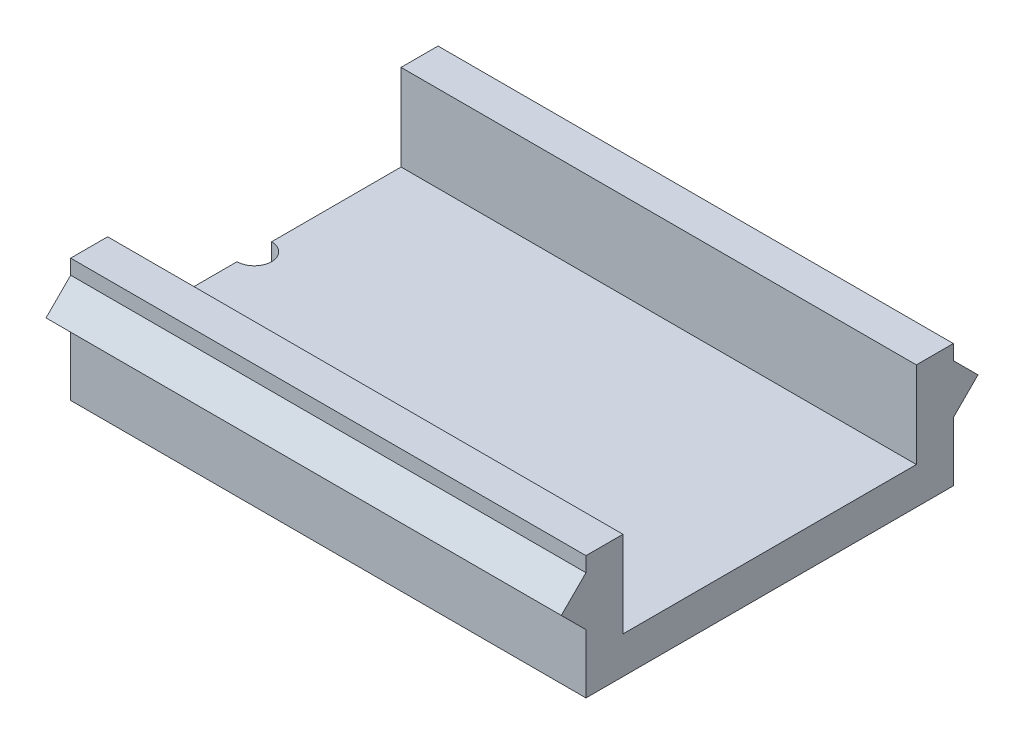
ISO-10303-21;
HEADER;
FILE_DESCRIPTION(('STEP AP214'),'2;1');
FILE_NAME('part.step','',(''),(''),'','','');
FILE_SCHEMA(('AUTOMOTIVE_DESIGN { 1 0 10303 214 1 1 1 1 }'));
ENDSEC;
DATA;
#1=APPLICATION_CONTEXT('core data for automotive mechanical design processes');
#2=APPLICATION_PROTOCOL_DEFINITION('international standard','automotive_design',2000,#1);
#3=PRODUCT_CONTEXT('',#1,'mechanical');
#4=PRODUCT('Part','Part','',(#3));
#5=PRODUCT_RELATED_PRODUCT_CATEGORY('part','',(#4));
#6=PRODUCT_DEFINITION_FORMATION('','',#4);
#7=PRODUCT_DEFINITION_CONTEXT('part definition',#1,'design');
#8=PRODUCT_DEFINITION('design','',#6,#7);
#9=PRODUCT_DEFINITION_SHAPE('','',#8);
#10=(LENGTH_UNIT() NAMED_UNIT(*) SI_UNIT(.MILLI.,.METRE.));
#11=(NAMED_UNIT(*) PLANE_ANGLE_UNIT() SI_UNIT($,.RADIAN.));
#12=(NAMED_UNIT(*) SI_UNIT($,.STERADIAN.) SOLID_ANGLE_UNIT());
#13=UNCERTAINTY_MEASURE_WITH_UNIT(LENGTH_MEASURE(1.E-05),#10,'distance_accuracy_value','');
#14=(GEOMETRIC_REPRESENTATION_CONTEXT(3) GLOBAL_UNCERTAINTY_ASSIGNED_CONTEXT((#13)) GLOBAL_UNIT_ASSIGNED_CONTEXT((#10,
#11,#12)) REPRESENTATION_CONTEXT('',''));
#15=CARTESIAN_POINT('',(0.,0.,0.));
#16=DIRECTION('',(0.,0.,1.));
#17=DIRECTION('',(1.,0.,0.));
#18=AXIS2_PLACEMENT_3D('',#15,#16,#17);
#19=CARTESIAN_POINT('',(-20.9,3.,0.));
#20=DIRECTION('',(0.,1.,0.));
#21=DIRECTION('',(0.,0.,1.));
#22=AXIS2_PLACEMENT_3D('',#19,#20,#21);
#23=PLANE('',#22);
#24=DIRECTION('',(-1.,0.,0.));
#25=VECTOR('',#24,1.);
#26=CARTESIAN_POINT('',(29.5023252670426,3.,11.9));
#27=LINE('',#26,#25);
#28=CARTESIAN_POINT('',(20.9,3.,11.9));
#29=VERTEX_POINT('',#28);
#30=CARTESIAN_POINT('',(-20.9,3.,11.9));
#31=VERTEX_POINT('',#30);
#32=EDGE_CURVE('E190',#29,#31,#27,.T.);
#33=ORIENTED_EDGE('',*,*,#32,.F.);
#34=DIRECTION('',(0.,0.,-1.));
#35=VECTOR('',#34,1.);
#36=CARTESIAN_POINT('',(20.9,3.,14.9));
#37=LINE('',#36,#35);
#38=CARTESIAN_POINT('',(20.9,3.,-11.9));
#39=VERTEX_POINT('',#38);
#40=EDGE_CURVE('E240',#29,#39,#37,.T.);
#41=ORIENTED_EDGE('',*,*,#40,.T.);
#42=DIRECTION('',(-1.,0.,0.));
#43=VECTOR('',#42,1.);
#44=CARTESIAN_POINT('',(29.5023252670426,3.,-11.9));
#45=LINE('',#44,#43);
#46=CARTESIAN_POINT('',(-20.9,3.,-11.9));
#47=VERTEX_POINT('',#46);
#48=EDGE_CURVE('E225',#39,#47,#45,.T.);
#49=ORIENTED_EDGE('',*,*,#48,.T.);
#50=DIRECTION('',(0.,0.,-1.));
#51=VECTOR('',#50,1.);
#52=CARTESIAN_POINT('',(-20.9,3.,-1.4));
#53=LINE('',#52,#51);
#54=CARTESIAN_POINT('',(-20.9,3.,-1.4));
#55=VERTEX_POINT('',#54);
#56=EDGE_CURVE('E242',#55,#47,#53,.T.);
#57=ORIENTED_EDGE('',*,*,#56,.F.);
#58=CARTESIAN_POINT('',(-20.9,3.,0.));
#59=DIRECTION('',(0.,1.,0.));
#60=DIRECTION('',(0.,0.,1.));
#61=AXIS2_PLACEMENT_3D('',#58,#59,#60);
#62=CIRCLE('',#61,1.4);
#63=CARTESIAN_POINT('',(-20.9,3.,1.4));
#64=VERTEX_POINT('',#63);
#65=EDGE_CURVE('E245',#64,#55,#62,.T.);
#66=ORIENTED_EDGE('',*,*,#65,.F.);
#67=DIRECTION('',(0.,0.,-1.));
#68=VECTOR('',#67,1.);
#69=CARTESIAN_POINT('',(-20.9,3.,14.9));
#70=LINE('',#69,#68);
#71=EDGE_CURVE('E161',#31,#64,#70,.T.);
#72=ORIENTED_EDGE('',*,*,#71,.F.);
#73=EDGE_LOOP('',(#33,#41,#49,#57,#66,#72));
#74=FACE_BOUND('',#73,.T.);
#75=ADVANCED_FACE('F35',(#74),#23,.T.);
#76=CARTESIAN_POINT('',(-20.9,3.,14.9));
#77=DIRECTION('',(0.,0.,-1.));
#78=DIRECTION('',(-1.,0.,0.));
#79=AXIS2_PLACEMENT_3D('',#76,#77,#78);
#80=PLANE('',#79);
#81=DIRECTION('',(1.,0.,0.));
#82=VECTOR('',#81,1.);
#83=CARTESIAN_POINT('',(-20.9,0.,14.9));
#84=LINE('',#83,#82);
#85=CARTESIAN_POINT('',(-20.9,0.,14.9));
#86=VERTEX_POINT('',#85);
#87=CARTESIAN_POINT('',(20.9,0.,14.9));
#88=VERTEX_POINT('',#87);
#89=EDGE_CURVE('E239',#86,#88,#84,.T.);
#90=ORIENTED_EDGE('',*,*,#89,.T.);
#91=DIRECTION('',(0.,-1.,0.));
#92=VECTOR('',#91,1.);
#93=CARTESIAN_POINT('',(20.9,3.,14.9));
#94=LINE('',#93,#92);
#95=CARTESIAN_POINT('',(20.9,4.80000000000002,14.9));
#96=VERTEX_POINT('',#95);
#97=EDGE_CURVE('E11',#96,#88,#94,.T.);
#98=ORIENTED_EDGE('',*,*,#97,.F.);
#99=DIRECTION('',(-1.,0.,0.));
#100=VECTOR('',#99,1.);
#101=CARTESIAN_POINT('',(29.5023252670426,4.80000000000002,14.9));
#102=LINE('',#101,#100);
#103=CARTESIAN_POINT('',(-20.9,4.80000000000002,14.9));
#104=VERTEX_POINT('',#103);
#105=EDGE_CURVE('E164',#96,#104,#102,.T.);
#106=ORIENTED_EDGE('',*,*,#105,.T.);
#107=DIRECTION('',(0.,-1.,0.));
#108=VECTOR('',#107,1.);
#109=CARTESIAN_POINT('',(-20.9,3.,14.9));
#110=LINE('',#109,#108);
#111=EDGE_CURVE('E149',#104,#86,#110,.T.);
#112=ORIENTED_EDGE('',*,*,#111,.T.);
#113=EDGE_LOOP('',(#90,#98,#106,#112));
#114=FACE_BOUND('',#113,.T.);
#115=ADVANCED_FACE('F37',(#114),#80,.F.);
#116=CARTESIAN_POINT('',(20.9,3.,14.9));
#117=DIRECTION('',(-1.,0.,0.));
#118=DIRECTION('',(0.,0.,1.));
#119=AXIS2_PLACEMENT_3D('',#116,#117,#118);
#120=PLANE('',#119);
#121=DIRECTION('',(0.,0.,-1.));
#122=VECTOR('',#121,1.);
#123=CARTESIAN_POINT('',(20.9,0.,14.9));
#124=LINE('',#123,#122);
#125=CARTESIAN_POINT('',(20.9,0.,-14.9));
#126=VERTEX_POINT('',#125);
#127=EDGE_CURVE('E250',#88,#126,#124,.T.);
#128=ORIENTED_EDGE('',*,*,#127,.T.);
#129=DIRECTION('',(0.,-1.,0.));
#130=VECTOR('',#129,1.);
#131=CARTESIAN_POINT('',(20.9,3.,-14.9));
#132=LINE('',#131,#130);
#133=CARTESIAN_POINT('',(20.9,4.80000000000002,-14.9));
#134=VERTEX_POINT('',#133);
#135=EDGE_CURVE('E43',#134,#126,#132,.T.);
#136=ORIENTED_EDGE('',*,*,#135,.F.);
#137=DIRECTION('',(0.,0.707106781186546,-0.707106781186549));
#138=VECTOR('',#137,1.);
#139=CARTESIAN_POINT('',(20.9,4.80000000000002,-14.9));
#140=LINE('',#139,#138);
#141=CARTESIAN_POINT('',(20.9,6.80000000000001,-16.9));
#142=VERTEX_POINT('',#141);
#143=EDGE_CURVE('E209',#134,#142,#140,.T.);
#144=ORIENTED_EDGE('',*,*,#143,.T.);
#145=DIRECTION('',(0.,0.707106781186546,0.707106781186549));
#146=VECTOR('',#145,1.);
#147=CARTESIAN_POINT('',(20.9,6.80000000000001,-16.9));
#148=LINE('',#147,#146);
#149=CARTESIAN_POINT('',(20.9,8.8,-14.9));
#150=VERTEX_POINT('',#149);
#151=EDGE_CURVE('E207',#142,#150,#148,.T.);
#152=ORIENTED_EDGE('',*,*,#151,.T.);
#153=DIRECTION('',(0.,1.,0.));
#154=VECTOR('',#153,1.);
#155=CARTESIAN_POINT('',(20.9,8.8,-14.9));
#156=LINE('',#155,#154);
#157=CARTESIAN_POINT('',(20.9,10.,-14.9));
#158=VERTEX_POINT('',#157);
#159=EDGE_CURVE('E204',#150,#158,#156,.T.);
#160=ORIENTED_EDGE('',*,*,#159,.T.);
#161=DIRECTION('',(0.,0.,1.));
#162=VECTOR('',#161,1.);
#163=CARTESIAN_POINT('',(20.9,10.,-14.9));
#164=LINE('',#163,#162);
#165=CARTESIAN_POINT('',(20.9,10.,-11.9));
#166=VERTEX_POINT('',#165);
#167=EDGE_CURVE('E202',#158,#166,#164,.T.);
#168=ORIENTED_EDGE('',*,*,#167,.T.);
#169=DIRECTION('',(0.,-1.,0.));
#170=VECTOR('',#169,1.);
#171=CARTESIAN_POINT('',(20.9,10.,-11.9));
#172=LINE('',#171,#170);
#173=EDGE_CURVE('E211',#166,#39,#172,.T.);
#174=ORIENTED_EDGE('',*,*,#173,.T.);
#175=ORIENTED_EDGE('',*,*,#40,.F.);
#176=DIRECTION('',(0.,1.,0.));
#177=VECTOR('',#176,1.);
#178=CARTESIAN_POINT('',(20.9,10.,11.9));
#179=LINE('',#178,#177);
#180=CARTESIAN_POINT('',(20.9,10.,11.9));
#181=VERTEX_POINT('',#180);
#182=EDGE_CURVE('E182',#29,#181,#179,.T.);
#183=ORIENTED_EDGE('',*,*,#182,.T.);
#184=DIRECTION('',(0.,0.,1.));
#185=VECTOR('',#184,1.);
#186=CARTESIAN_POINT('',(20.9,10.,14.9));
#187=LINE('',#186,#185);
#188=CARTESIAN_POINT('',(20.9,10.,14.9));
#189=VERTEX_POINT('',#188);
#190=EDGE_CURVE('E311',#181,#189,#187,.T.);
#191=ORIENTED_EDGE('',*,*,#190,.T.);
#192=DIRECTION('',(0.,-1.,0.));
#193=VECTOR('',#192,1.);
#194=CARTESIAN_POINT('',(20.9,8.8,14.9));
#195=LINE('',#194,#193);
#196=CARTESIAN_POINT('',(20.9,8.8,14.9));
#197=VERTEX_POINT('',#196);
#198=EDGE_CURVE('E312',#189,#197,#195,.T.);
#199=ORIENTED_EDGE('',*,*,#198,.T.);
#200=DIRECTION('',(0.,-0.707106781186546,0.707106781186549));
#201=VECTOR('',#200,1.);
#202=CARTESIAN_POINT('',(20.9,6.80000000000001,16.9));
#203=LINE('',#202,#201);
#204=CARTESIAN_POINT('',(20.9,6.80000000000001,16.9));
#205=VERTEX_POINT('',#204);
#206=EDGE_CURVE('E192',#197,#205,#203,.T.);
#207=ORIENTED_EDGE('',*,*,#206,.T.);
#208=DIRECTION('',(0.,-0.707106781186546,-0.707106781186549));
#209=VECTOR('',#208,1.);
#210=CARTESIAN_POINT('',(20.9,4.80000000000002,14.9));
#211=LINE('',#210,#209);
#212=EDGE_CURVE('E200',#205,#96,#211,.T.);
#213=ORIENTED_EDGE('',*,*,#212,.T.);
#214=ORIENTED_EDGE('',*,*,#97,.T.);
#215=EDGE_LOOP('',(#128,#136,#144,#152,#160,#168,#174,#175,#183,#191,#199,#207,#213,#214));
#216=FACE_BOUND('',#215,.T.);
#217=ADVANCED_FACE('F273',(#216),#120,.F.);
#218=CARTESIAN_POINT('',(-20.9,3.,-14.9));
#219=DIRECTION('',(0.,0.,-1.));
#220=DIRECTION('',(-1.,0.,0.));
#221=AXIS2_PLACEMENT_3D('',#218,#219,#220);
#222=PLANE('',#221);
#223=DIRECTION('',(1.,0.,0.));
#224=VECTOR('',#223,1.);
#225=CARTESIAN_POINT('',(-20.9,0.,-14.9));
#226=LINE('',#225,#224);
#227=CARTESIAN_POINT('',(-20.9,0.,-14.9));
#228=VERTEX_POINT('',#227);
#229=EDGE_CURVE('E253',#228,#126,#226,.T.);
#230=ORIENTED_EDGE('',*,*,#229,.F.);
#231=DIRECTION('',(0.,-1.,0.));
#232=VECTOR('',#231,1.);
#233=CARTESIAN_POINT('',(-20.9,3.,-14.9));
#234=LINE('',#233,#232);
#235=CARTESIAN_POINT('',(-20.9,4.80000000000002,-14.9));
#236=VERTEX_POINT('',#235);
#237=EDGE_CURVE('E266',#236,#228,#234,.T.);
#238=ORIENTED_EDGE('',*,*,#237,.F.);
#239=DIRECTION('',(-1.,0.,0.));
#240=VECTOR('',#239,1.);
#241=CARTESIAN_POINT('',(29.5023252670426,4.80000000000002,-14.9));
#242=LINE('',#241,#240);
#243=EDGE_CURVE('E205',#134,#236,#242,.T.);
#244=ORIENTED_EDGE('',*,*,#243,.F.);
#245=ORIENTED_EDGE('',*,*,#135,.T.);
#246=EDGE_LOOP('',(#230,#238,#244,#245));
#247=FACE_BOUND('',#246,.T.);
#248=ADVANCED_FACE('F270',(#247),#222,.T.);
#249=CARTESIAN_POINT('',(-20.9,3.,-1.4));
#250=DIRECTION('',(-1.,0.,0.));
#251=DIRECTION('',(0.,0.,1.));
#252=AXIS2_PLACEMENT_3D('',#249,#250,#251);
#253=PLANE('',#252);
#254=DIRECTION('',(0.,0.,-1.));
#255=VECTOR('',#254,1.);
#256=CARTESIAN_POINT('',(-20.9,0.,-1.4));
#257=LINE('',#256,#255);
#258=CARTESIAN_POINT('',(-20.9,0.,-1.4));
#259=VERTEX_POINT('',#258);
#260=EDGE_CURVE('E256',#259,#228,#257,.T.);
#261=ORIENTED_EDGE('',*,*,#260,.F.);
#262=DIRECTION('',(0.,-1.,0.));
#263=VECTOR('',#262,1.);
#264=CARTESIAN_POINT('',(-20.9,3.,-1.4));
#265=LINE('',#264,#263);
#266=EDGE_CURVE('E264',#55,#259,#265,.T.);
#267=ORIENTED_EDGE('',*,*,#266,.F.);
#268=ORIENTED_EDGE('',*,*,#56,.T.);
#269=DIRECTION('',(0.,1.,0.));
#270=VECTOR('',#269,1.);
#271=CARTESIAN_POINT('',(-20.9,10.,-11.9));
#272=LINE('',#271,#270);
#273=CARTESIAN_POINT('',(-20.9,10.,-11.9));
#274=VERTEX_POINT('',#273);
#275=EDGE_CURVE('E58',#47,#274,#272,.T.);
#276=ORIENTED_EDGE('',*,*,#275,.T.);
#277=DIRECTION('',(0.,0.,-1.));
#278=VECTOR('',#277,1.);
#279=CARTESIAN_POINT('',(-20.9,10.,-14.9));
#280=LINE('',#279,#278);
#281=CARTESIAN_POINT('',(-20.9,10.,-14.9));
#282=VERTEX_POINT('',#281);
#283=EDGE_CURVE('E213',#274,#282,#280,.T.);
#284=ORIENTED_EDGE('',*,*,#283,.T.);
#285=DIRECTION('',(0.,-1.,0.));
#286=VECTOR('',#285,1.);
#287=CARTESIAN_POINT('',(-20.9,8.8,-14.9));
#288=LINE('',#287,#286);
#289=CARTESIAN_POINT('',(-20.9,8.8,-14.9));
#290=VERTEX_POINT('',#289);
#291=EDGE_CURVE('E216',#282,#290,#288,.T.);
#292=ORIENTED_EDGE('',*,*,#291,.T.);
#293=DIRECTION('',(0.,-0.707106781186546,-0.707106781186549));
#294=VECTOR('',#293,1.);
#295=CARTESIAN_POINT('',(-20.9,6.80000000000001,-16.9));
#296=LINE('',#295,#294);
#297=CARTESIAN_POINT('',(-20.9,6.80000000000001,-16.9));
#298=VERTEX_POINT('',#297);
#299=EDGE_CURVE('E219',#290,#298,#296,.T.);
#300=ORIENTED_EDGE('',*,*,#299,.T.);
#301=DIRECTION('',(0.,-0.707106781186546,0.707106781186549));
#302=VECTOR('',#301,1.);
#303=CARTESIAN_POINT('',(-20.9,4.80000000000002,-14.9));
#304=LINE('',#303,#302);
#305=EDGE_CURVE('E222',#298,#236,#304,.T.);
#306=ORIENTED_EDGE('',*,*,#305,.T.);
#307=ORIENTED_EDGE('',*,*,#237,.T.);
#308=EDGE_LOOP('',(#261,#267,#268,#276,#284,#292,#300,#306,#307));
#309=FACE_BOUND('',#308,.T.);
#310=ADVANCED_FACE('F279',(#309),#253,.T.);
#311=CARTESIAN_POINT('',(-20.9,3.,0.));
#312=DIRECTION('',(0.,-1.,0.));
#313=DIRECTION('',(0.,0.,-1.));
#314=AXIS2_PLACEMENT_3D('',#311,#312,#313);
#315=CYLINDRICAL_SURFACE('',#314,1.4);
#316=CARTESIAN_POINT('',(-20.9,0.,0.));
#317=DIRECTION('',(0.,1.,0.));
#318=DIRECTION('',(0.,0.,1.));
#319=AXIS2_PLACEMENT_3D('',#316,#317,#318);
#320=CIRCLE('',#319,1.4);
#321=CARTESIAN_POINT('',(-20.9,0.,1.4));
#322=VERTEX_POINT('',#321);
#323=EDGE_CURVE('E259',#322,#259,#320,.T.);
#324=ORIENTED_EDGE('',*,*,#323,.F.);
#325=DIRECTION('',(0.,-1.,0.));
#326=VECTOR('',#325,1.);
#327=CARTESIAN_POINT('',(-20.9,3.,1.4));
#328=LINE('',#327,#326);
#329=EDGE_CURVE('E160',#64,#322,#328,.T.);
#330=ORIENTED_EDGE('',*,*,#329,.F.);
#331=ORIENTED_EDGE('',*,*,#65,.T.);
#332=ORIENTED_EDGE('',*,*,#266,.T.);
#333=EDGE_LOOP('',(#324,#330,#331,#332));
#334=FACE_BOUND('',#333,.T.);
#335=ADVANCED_FACE('F329',(#334),#315,.F.);
#336=CARTESIAN_POINT('',(-20.9,3.,14.9));
#337=DIRECTION('',(-1.,0.,0.));
#338=DIRECTION('',(0.,0.,1.));
#339=AXIS2_PLACEMENT_3D('',#336,#337,#338);
#340=PLANE('',#339);
#341=DIRECTION('',(0.,0.,-1.));
#342=VECTOR('',#341,1.);
#343=CARTESIAN_POINT('',(-20.9,0.,14.9));
#344=LINE('',#343,#342);
#345=EDGE_CURVE('E156',#86,#322,#344,.T.);
#346=ORIENTED_EDGE('',*,*,#345,.F.);
#347=ORIENTED_EDGE('',*,*,#111,.F.);
#348=DIRECTION('',(0.,0.707106781186546,0.707106781186549));
#349=VECTOR('',#348,1.);
#350=CARTESIAN_POINT('',(-20.9,4.80000000000002,14.9));
#351=LINE('',#350,#349);
#352=CARTESIAN_POINT('',(-20.9,6.80000000000001,16.9));
#353=VERTEX_POINT('',#352);
#354=EDGE_CURVE('E154',#104,#353,#351,.T.);
#355=ORIENTED_EDGE('',*,*,#354,.T.);
#356=DIRECTION('',(0.,0.707106781186546,-0.707106781186549));
#357=VECTOR('',#356,1.);
#358=CARTESIAN_POINT('',(-20.9,6.80000000000001,16.9));
#359=LINE('',#358,#357);
#360=CARTESIAN_POINT('',(-20.9,8.8,14.9));
#361=VERTEX_POINT('',#360);
#362=EDGE_CURVE('E173',#353,#361,#359,.T.);
#363=ORIENTED_EDGE('',*,*,#362,.T.);
#364=DIRECTION('',(0.,1.,0.));
#365=VECTOR('',#364,1.);
#366=CARTESIAN_POINT('',(-20.9,8.8,14.9));
#367=LINE('',#366,#365);
#368=CARTESIAN_POINT('',(-20.9,10.,14.9));
#369=VERTEX_POINT('',#368);
#370=EDGE_CURVE('E176',#361,#369,#367,.T.);
#371=ORIENTED_EDGE('',*,*,#370,.T.);
#372=DIRECTION('',(0.,0.,-1.));
#373=VECTOR('',#372,1.);
#374=CARTESIAN_POINT('',(-20.9,10.,14.9));
#375=LINE('',#374,#373);
#376=CARTESIAN_POINT('',(-20.9,10.,11.9));
#377=VERTEX_POINT('',#376);
#378=EDGE_CURVE('E187',#369,#377,#375,.T.);
#379=ORIENTED_EDGE('',*,*,#378,.T.);
#380=DIRECTION('',(0.,-1.,0.));
#381=VECTOR('',#380,1.);
#382=CARTESIAN_POINT('',(-20.9,10.,11.9));
#383=LINE('',#382,#381);
#384=EDGE_CURVE('E50',#377,#31,#383,.T.);
#385=ORIENTED_EDGE('',*,*,#384,.T.);
#386=ORIENTED_EDGE('',*,*,#71,.T.);
#387=ORIENTED_EDGE('',*,*,#329,.T.);
#388=EDGE_LOOP('',(#346,#347,#355,#363,#371,#379,#385,#386,#387));
#389=FACE_BOUND('',#388,.T.);
#390=ADVANCED_FACE('F151',(#389),#340,.T.);
#391=CARTESIAN_POINT('',(-20.9,0.,0.));
#392=DIRECTION('',(0.,1.,0.));
#393=DIRECTION('',(0.,0.,1.));
#394=AXIS2_PLACEMENT_3D('',#391,#392,#393);
#395=PLANE('',#394);
#396=CARTESIAN_POINT('',(0.,0.,0.));
#397=DIRECTION('',(0.,-1.,0.));
#398=DIRECTION('',(0.,0.,-1.));
#399=AXIS2_PLACEMENT_3D('',#396,#397,#398);
#400=CIRCLE('',#399,2.6);
#401=CARTESIAN_POINT('',(0.,0.,-2.6));
#402=VERTEX_POINT('',#401);
#403=EDGE_CURVE('E179',#402,#402,#400,.T.);
#404=ORIENTED_EDGE('',*,*,#403,.F.);
#405=EDGE_LOOP('',(#404));
#406=FACE_BOUND('',#405,.T.);
#407=ORIENTED_EDGE('',*,*,#89,.F.);
#408=ORIENTED_EDGE('',*,*,#345,.T.);
#409=ORIENTED_EDGE('',*,*,#323,.T.);
#410=ORIENTED_EDGE('',*,*,#260,.T.);
#411=ORIENTED_EDGE('',*,*,#229,.T.);
#412=ORIENTED_EDGE('',*,*,#127,.F.);
#413=EDGE_LOOP('',(#407,#408,#409,#410,#411,#412));
#414=FACE_BOUND('',#413,.T.);
#415=ADVANCED_FACE('F275',(#406,#414),#395,.F.);
#416=CARTESIAN_POINT('',(29.5023252670426,4.80000000000002,-14.9));
#417=DIRECTION('',(0.,-0.707106781186549,-0.707106781186546));
#418=DIRECTION('',(0.,0.707106781186546,-0.707106781186549));
#419=AXIS2_PLACEMENT_3D('',#416,#417,#418);
#420=PLANE('',#419);
#421=ORIENTED_EDGE('',*,*,#143,.F.);
#422=ORIENTED_EDGE('',*,*,#243,.T.);
#423=ORIENTED_EDGE('',*,*,#305,.F.);
#424=DIRECTION('',(-1.,0.,0.));
#425=VECTOR('',#424,1.);
#426=CARTESIAN_POINT('',(29.5023252670426,6.80000000000001,-16.9));
#427=LINE('',#426,#425);
#428=EDGE_CURVE('E228',#142,#298,#427,.T.);
#429=ORIENTED_EDGE('',*,*,#428,.F.);
#430=EDGE_LOOP('',(#421,#422,#423,#429));
#431=FACE_BOUND('',#430,.T.);
#432=ADVANCED_FACE('F283',(#431),#420,.T.);
#433=CARTESIAN_POINT('',(29.5023252670426,6.80000000000001,-16.9));
#434=DIRECTION('',(0.,0.707106781186549,-0.707106781186546));
#435=DIRECTION('',(0.,0.707106781186546,0.707106781186549));
#436=AXIS2_PLACEMENT_3D('',#433,#434,#435);
#437=PLANE('',#436);
#438=ORIENTED_EDGE('',*,*,#151,.F.);
#439=ORIENTED_EDGE('',*,*,#428,.T.);
#440=ORIENTED_EDGE('',*,*,#299,.F.);
#441=DIRECTION('',(-1.,0.,0.));
#442=VECTOR('',#441,1.);
#443=CARTESIAN_POINT('',(29.5023252670426,8.8,-14.9));
#444=LINE('',#443,#442);
#445=EDGE_CURVE('E230',#150,#290,#444,.T.);
#446=ORIENTED_EDGE('',*,*,#445,.F.);
#447=EDGE_LOOP('',(#438,#439,#440,#446));
#448=FACE_BOUND('',#447,.T.);
#449=ADVANCED_FACE('F289',(#448),#437,.T.);
#450=CARTESIAN_POINT('',(29.5023252670426,8.8,-14.9));
#451=DIRECTION('',(0.,0.,-1.));
#452=DIRECTION('',(-1.,0.,0.));
#453=AXIS2_PLACEMENT_3D('',#450,#451,#452);
#454=PLANE('',#453);
#455=ORIENTED_EDGE('',*,*,#159,.F.);
#456=ORIENTED_EDGE('',*,*,#445,.T.);
#457=ORIENTED_EDGE('',*,*,#291,.F.);
#458=DIRECTION('',(-1.,0.,0.));
#459=VECTOR('',#458,1.);
#460=CARTESIAN_POINT('',(29.5023252670426,10.,-14.9));
#461=LINE('',#460,#459);
#462=EDGE_CURVE('E232',#158,#282,#461,.T.);
#463=ORIENTED_EDGE('',*,*,#462,.F.);
#464=EDGE_LOOP('',(#455,#456,#457,#463));
#465=FACE_BOUND('',#464,.T.);
#466=ADVANCED_FACE('F293',(#465),#454,.T.);
#467=CARTESIAN_POINT('',(29.5023252670426,10.,-14.9));
#468=DIRECTION('',(0.,1.,0.));
#469=DIRECTION('',(0.,0.,1.));
#470=AXIS2_PLACEMENT_3D('',#467,#468,#469);
#471=PLANE('',#470);
#472=ORIENTED_EDGE('',*,*,#167,.F.);
#473=ORIENTED_EDGE('',*,*,#462,.T.);
#474=ORIENTED_EDGE('',*,*,#283,.F.);
#475=DIRECTION('',(-1.,0.,0.));
#476=VECTOR('',#475,1.);
#477=CARTESIAN_POINT('',(29.5023252670426,10.,-11.9));
#478=LINE('',#477,#476);
#479=EDGE_CURVE('E234',#166,#274,#478,.T.);
#480=ORIENTED_EDGE('',*,*,#479,.F.);
#481=EDGE_LOOP('',(#472,#473,#474,#480));
#482=FACE_BOUND('',#481,.T.);
#483=ADVANCED_FACE('F298',(#482),#471,.T.);
#484=CARTESIAN_POINT('',(29.5023252670426,10.,-11.9));
#485=DIRECTION('',(0.,0.,1.));
#486=DIRECTION('',(1.,0.,0.));
#487=AXIS2_PLACEMENT_3D('',#484,#485,#486);
#488=PLANE('',#487);
#489=ORIENTED_EDGE('',*,*,#173,.F.);
#490=ORIENTED_EDGE('',*,*,#479,.T.);
#491=ORIENTED_EDGE('',*,*,#275,.F.);
#492=ORIENTED_EDGE('',*,*,#48,.F.);
#493=EDGE_LOOP('',(#489,#490,#491,#492));
#494=FACE_BOUND('',#493,.T.);
#495=ADVANCED_FACE('F301',(#494),#488,.T.);
#496=CARTESIAN_POINT('',(29.5023252670426,10.,11.9));
#497=DIRECTION('',(0.,0.,-1.));
#498=DIRECTION('',(-1.,0.,0.));
#499=AXIS2_PLACEMENT_3D('',#496,#497,#498);
#500=PLANE('',#499);
#501=ORIENTED_EDGE('',*,*,#182,.F.);
#502=ORIENTED_EDGE('',*,*,#32,.T.);
#503=ORIENTED_EDGE('',*,*,#384,.F.);
#504=DIRECTION('',(-1.,0.,0.));
#505=VECTOR('',#504,1.);
#506=CARTESIAN_POINT('',(29.5023252670426,10.,11.9));
#507=LINE('',#506,#505);
#508=EDGE_CURVE('E193',#181,#377,#507,.T.);
#509=ORIENTED_EDGE('',*,*,#508,.F.);
#510=EDGE_LOOP('',(#501,#502,#503,#509));
#511=FACE_BOUND('',#510,.T.);
#512=ADVANCED_FACE('F309',(#511),#500,.T.);
#513=CARTESIAN_POINT('',(29.5023252670426,10.,14.9));
#514=DIRECTION('',(0.,1.,0.));
#515=DIRECTION('',(0.,0.,1.));
#516=AXIS2_PLACEMENT_3D('',#513,#514,#515);
#517=PLANE('',#516);
#518=ORIENTED_EDGE('',*,*,#190,.F.);
#519=ORIENTED_EDGE('',*,*,#508,.T.);
#520=ORIENTED_EDGE('',*,*,#378,.F.);
#521=DIRECTION('',(-1.,0.,0.));
#522=VECTOR('',#521,1.);
#523=CARTESIAN_POINT('',(29.5023252670426,10.,14.9));
#524=LINE('',#523,#522);
#525=EDGE_CURVE('E195',#189,#369,#524,.T.);
#526=ORIENTED_EDGE('',*,*,#525,.F.);
#527=EDGE_LOOP('',(#518,#519,#520,#526));
#528=FACE_BOUND('',#527,.T.);
#529=ADVANCED_FACE('F354',(#528),#517,.T.);
#530=CARTESIAN_POINT('',(29.5023252670426,8.8,14.9));
#531=DIRECTION('',(0.,0.,1.));
#532=DIRECTION('',(1.,0.,0.));
#533=AXIS2_PLACEMENT_3D('',#530,#531,#532);
#534=PLANE('',#533);
#535=ORIENTED_EDGE('',*,*,#198,.F.);
#536=ORIENTED_EDGE('',*,*,#525,.T.);
#537=ORIENTED_EDGE('',*,*,#370,.F.);
#538=DIRECTION('',(-1.,0.,0.));
#539=VECTOR('',#538,1.);
#540=CARTESIAN_POINT('',(29.5023252670426,8.8,14.9));
#541=LINE('',#540,#539);
#542=EDGE_CURVE('E197',#197,#361,#541,.T.);
#543=ORIENTED_EDGE('',*,*,#542,.F.);
#544=EDGE_LOOP('',(#535,#536,#537,#543));
#545=FACE_BOUND('',#544,.T.);
#546=ADVANCED_FACE('F350',(#545),#534,.T.);
#547=CARTESIAN_POINT('',(29.5023252670426,6.80000000000001,16.9));
#548=DIRECTION('',(0.,0.707106781186549,0.707106781186546));
#549=DIRECTION('',(0.,-0.707106781186546,0.707106781186549));
#550=AXIS2_PLACEMENT_3D('',#547,#548,#549);
#551=PLANE('',#550);
#552=ORIENTED_EDGE('',*,*,#206,.F.);
#553=ORIENTED_EDGE('',*,*,#542,.T.);
#554=ORIENTED_EDGE('',*,*,#362,.F.);
#555=DIRECTION('',(-1.,0.,0.));
#556=VECTOR('',#555,1.);
#557=CARTESIAN_POINT('',(29.5023252670426,6.80000000000001,16.9));
#558=LINE('',#557,#556);
#559=EDGE_CURVE('E168',#205,#353,#558,.T.);
#560=ORIENTED_EDGE('',*,*,#559,.F.);
#561=EDGE_LOOP('',(#552,#553,#554,#560));
#562=FACE_BOUND('',#561,.T.);
#563=ADVANCED_FACE('F347',(#562),#551,.T.);
#564=CARTESIAN_POINT('',(29.5023252670426,4.80000000000002,14.9));
#565=DIRECTION('',(0.,-0.707106781186549,0.707106781186546));
#566=DIRECTION('',(0.,-0.707106781186546,-0.707106781186549));
#567=AXIS2_PLACEMENT_3D('',#564,#565,#566);
#568=PLANE('',#567);
#569=ORIENTED_EDGE('',*,*,#212,.F.);
#570=ORIENTED_EDGE('',*,*,#559,.T.);
#571=ORIENTED_EDGE('',*,*,#354,.F.);
#572=ORIENTED_EDGE('',*,*,#105,.F.);
#573=EDGE_LOOP('',(#569,#570,#571,#572));
#574=FACE_BOUND('',#573,.T.);
#575=ADVANCED_FACE('F170',(#574),#568,.T.);
#576=CARTESIAN_POINT('',(0.,0.6,0.));
#577=DIRECTION('',(0.,-1.,0.));
#578=DIRECTION('',(0.,0.,-1.));
#579=AXIS2_PLACEMENT_3D('',#576,#577,#578);
#580=CYLINDRICAL_SURFACE('',#579,2.6);
#581=CARTESIAN_POINT('',(0.,0.6,0.));
#582=DIRECTION('',(0.,-1.,0.));
#583=DIRECTION('',(0.,0.,-1.));
#584=AXIS2_PLACEMENT_3D('',#581,#582,#583);
#585=CIRCLE('',#584,2.6);
#586=CARTESIAN_POINT('',(0.,0.6,-2.6));
#587=VERTEX_POINT('',#586);
#588=EDGE_CURVE('E174',#587,#587,#585,.T.);
#589=ORIENTED_EDGE('',*,*,#588,.F.);
#590=EDGE_LOOP('',(#589));
#591=FACE_BOUND('',#590,.T.);
#592=ORIENTED_EDGE('',*,*,#403,.T.);
#593=EDGE_LOOP('',(#592));
#594=FACE_BOUND('',#593,.T.);
#595=ADVANCED_FACE('F320',(#591,#594),#580,.F.);
#596=CARTESIAN_POINT('',(0.,0.6,0.));
#597=DIRECTION('',(0.,-1.,0.));
#598=DIRECTION('',(0.,0.,-1.));
#599=AXIS2_PLACEMENT_3D('',#596,#597,#598);
#600=PLANE('',#599);
#601=ORIENTED_EDGE('',*,*,#588,.T.);
#602=EDGE_LOOP('',(#601));
#603=FACE_BOUND('',#602,.T.);
#604=ADVANCED_FACE('F363',(#603),#600,.T.);
#605=CLOSED_SHELL('',(#75,#115,#217,#248,#310,#335,#390,#415,#432,#449,#466,#483,#495,#512,#529,
#546,#563,#575,#595,#604));
#606=MANIFOLD_SOLID_BREP('B2',#605);
#607=ADVANCED_BREP_SHAPE_REPRESENTATION('',(#18,#606),#14);
#608=SHAPE_DEFINITION_REPRESENTATION(#9,#607);
ENDSEC;
END-ISO-10303-21;
